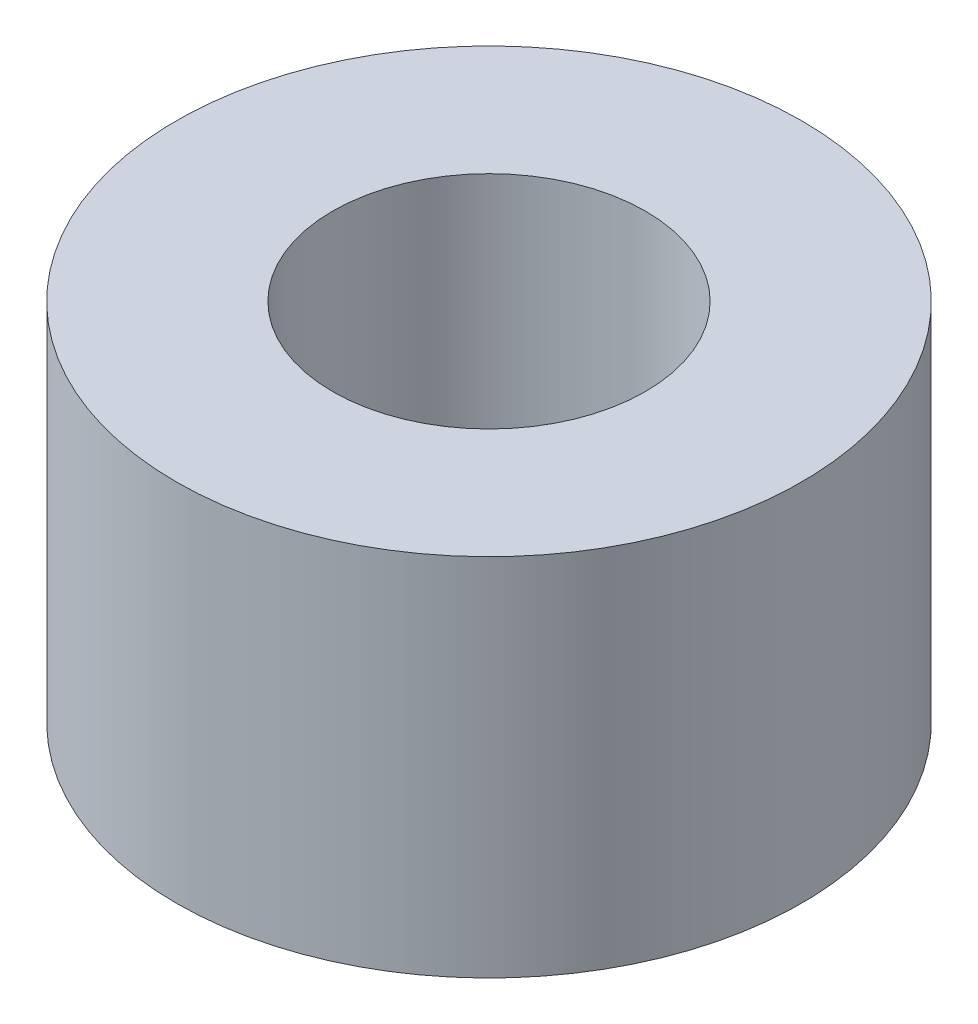
ISO-10303-21;
HEADER;
FILE_DESCRIPTION(('STEP AP214'),'2;1');
FILE_NAME('part.step','',(''),(''),'','','');
FILE_SCHEMA(('AUTOMOTIVE_DESIGN { 1 0 10303 214 1 1 1 1 }'));
ENDSEC;
DATA;
#1=APPLICATION_CONTEXT('core data for automotive mechanical design processes');
#2=APPLICATION_PROTOCOL_DEFINITION('international standard','automotive_design',2000,#1);
#3=PRODUCT_CONTEXT('',#1,'mechanical');
#4=PRODUCT('Part','Part','',(#3));
#5=PRODUCT_RELATED_PRODUCT_CATEGORY('part','',(#4));
#6=PRODUCT_DEFINITION_FORMATION('','',#4);
#7=PRODUCT_DEFINITION_CONTEXT('part definition',#1,'design');
#8=PRODUCT_DEFINITION('design','',#6,#7);
#9=PRODUCT_DEFINITION_SHAPE('','',#8);
#10=(LENGTH_UNIT() NAMED_UNIT(*) SI_UNIT(.MILLI.,.METRE.));
#11=(NAMED_UNIT(*) PLANE_ANGLE_UNIT() SI_UNIT($,.RADIAN.));
#12=(NAMED_UNIT(*) SI_UNIT($,.STERADIAN.) SOLID_ANGLE_UNIT());
#13=UNCERTAINTY_MEASURE_WITH_UNIT(LENGTH_MEASURE(1.E-05),#10,'distance_accuracy_value','');
#14=(GEOMETRIC_REPRESENTATION_CONTEXT(3) GLOBAL_UNCERTAINTY_ASSIGNED_CONTEXT((#13)) GLOBAL_UNIT_ASSIGNED_CONTEXT((#10,
#11,#12)) REPRESENTATION_CONTEXT('',''));
#15=CARTESIAN_POINT('',(0.,0.,0.));
#16=DIRECTION('',(0.,0.,1.));
#17=DIRECTION('',(1.,0.,0.));
#18=AXIS2_PLACEMENT_3D('',#15,#16,#17);
#19=CARTESIAN_POINT('',(0.,3.5,0.));
#20=DIRECTION('',(0.,1.,0.));
#21=DIRECTION('',(0.,0.,1.));
#22=AXIS2_PLACEMENT_3D('',#19,#20,#21);
#23=PLANE('',#22);
#24=CARTESIAN_POINT('',(0.,3.5,0.));
#25=DIRECTION('',(0.,1.,0.));
#26=DIRECTION('',(0.,0.,1.));
#27=AXIS2_PLACEMENT_3D('',#24,#25,#26);
#28=CIRCLE('',#27,3.);
#29=CARTESIAN_POINT('',(0.,3.5,3.));
#30=VERTEX_POINT('',#29);
#31=EDGE_CURVE('E10',#30,#30,#28,.T.);
#32=ORIENTED_EDGE('',*,*,#31,.T.);
#33=EDGE_LOOP('',(#32));
#34=FACE_BOUND('',#33,.T.);
#35=CARTESIAN_POINT('',(0.,3.5,0.));
#36=DIRECTION('',(0.,1.,0.));
#37=DIRECTION('',(0.,0.,1.));
#38=AXIS2_PLACEMENT_3D('',#35,#36,#37);
#39=CIRCLE('',#38,1.5);
#40=CARTESIAN_POINT('',(0.,3.5,1.5));
#41=VERTEX_POINT('',#40);
#42=EDGE_CURVE('E46',#41,#41,#39,.T.);
#43=ORIENTED_EDGE('',*,*,#42,.F.);
#44=EDGE_LOOP('',(#43));
#45=FACE_BOUND('',#44,.T.);
#46=ADVANCED_FACE('F35',(#34,#45),#23,.T.);
#47=CARTESIAN_POINT('',(0.,0.,0.));
#48=DIRECTION('',(0.,1.,0.));
#49=DIRECTION('',(0.,0.,1.));
#50=AXIS2_PLACEMENT_3D('',#47,#48,#49);
#51=PLANE('',#50);
#52=CARTESIAN_POINT('',(0.,0.,0.));
#53=DIRECTION('',(0.,1.,0.));
#54=DIRECTION('',(0.,0.,1.));
#55=AXIS2_PLACEMENT_3D('',#52,#53,#54);
#56=CIRCLE('',#55,3.);
#57=CARTESIAN_POINT('',(0.,0.,3.));
#58=VERTEX_POINT('',#57);
#59=EDGE_CURVE('E39',#58,#58,#56,.T.);
#60=ORIENTED_EDGE('',*,*,#59,.F.);
#61=EDGE_LOOP('',(#60));
#62=FACE_BOUND('',#61,.T.);
#63=CARTESIAN_POINT('',(0.,0.,0.));
#64=DIRECTION('',(0.,1.,0.));
#65=DIRECTION('',(0.,0.,1.));
#66=AXIS2_PLACEMENT_3D('',#63,#64,#65);
#67=CIRCLE('',#66,1.5);
#68=CARTESIAN_POINT('',(0.,0.,1.5));
#69=VERTEX_POINT('',#68);
#70=EDGE_CURVE('E48',#69,#69,#67,.T.);
#71=ORIENTED_EDGE('',*,*,#70,.T.);
#72=EDGE_LOOP('',(#71));
#73=FACE_BOUND('',#72,.T.);
#74=ADVANCED_FACE('F58',(#62,#73),#51,.F.);
#75=CARTESIAN_POINT('',(0.,3.5,0.));
#76=DIRECTION('',(0.,-1.,0.));
#77=DIRECTION('',(0.,0.,-1.));
#78=AXIS2_PLACEMENT_3D('',#75,#76,#77);
#79=CYLINDRICAL_SURFACE('',#78,3.);
#80=ORIENTED_EDGE('',*,*,#31,.F.);
#81=EDGE_LOOP('',(#80));
#82=FACE_BOUND('',#81,.T.);
#83=ORIENTED_EDGE('',*,*,#59,.T.);
#84=EDGE_LOOP('',(#83));
#85=FACE_BOUND('',#84,.T.);
#86=ADVANCED_FACE('F37',(#82,#85),#79,.T.);
#87=CARTESIAN_POINT('',(0.,3.5,0.));
#88=DIRECTION('',(0.,-1.,0.));
#89=DIRECTION('',(0.,0.,-1.));
#90=AXIS2_PLACEMENT_3D('',#87,#88,#89);
#91=CYLINDRICAL_SURFACE('',#90,1.5);
#92=ORIENTED_EDGE('',*,*,#42,.T.);
#93=EDGE_LOOP('',(#92));
#94=FACE_BOUND('',#93,.T.);
#95=ORIENTED_EDGE('',*,*,#70,.F.);
#96=EDGE_LOOP('',(#95));
#97=FACE_BOUND('',#96,.T.);
#98=ADVANCED_FACE('F54',(#94,#97),#91,.F.);
#99=CLOSED_SHELL('',(#46,#74,#86,#98));
#100=MANIFOLD_SOLID_BREP('B2',#99);
#101=ADVANCED_BREP_SHAPE_REPRESENTATION('',(#18,#100),#14);
#102=SHAPE_DEFINITION_REPRESENTATION(#9,#101);
ENDSEC;
END-ISO-10303-21;
